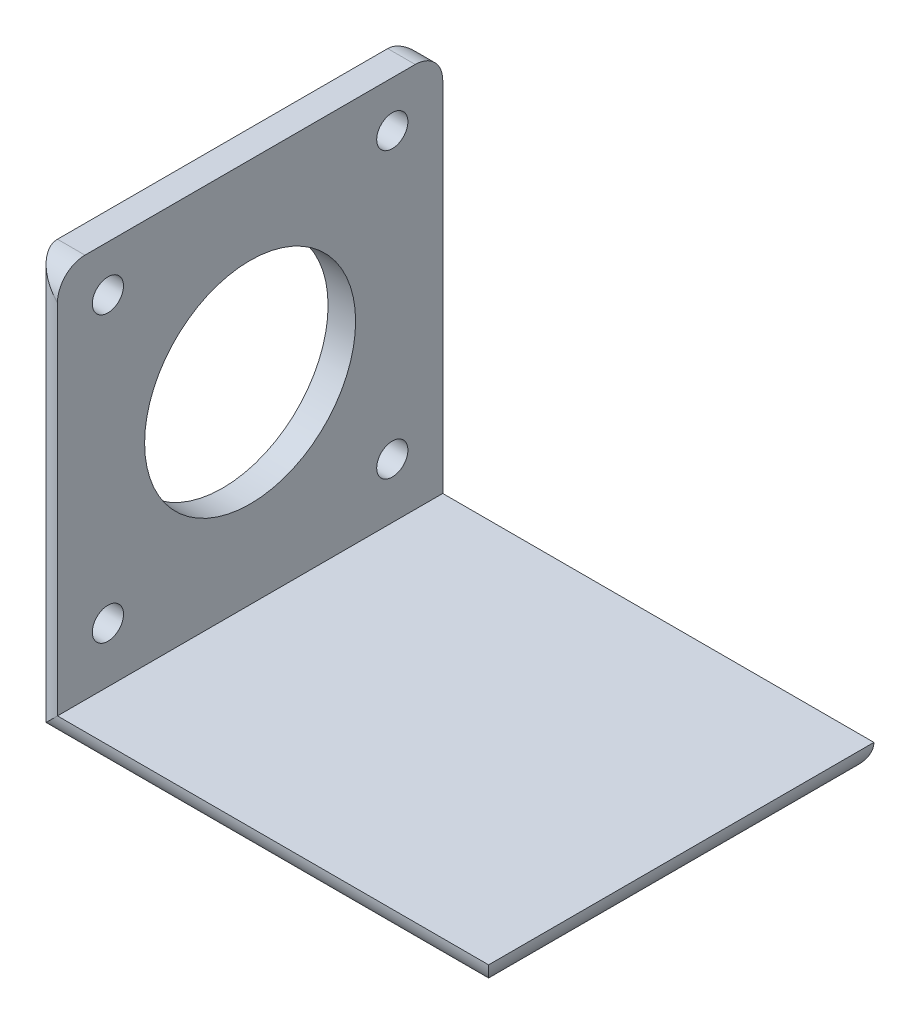
ISO-10303-21;
HEADER;
FILE_DESCRIPTION(('STEP AP214'),'2;1');
FILE_NAME('part.step','',(''),(''),'','','');
FILE_SCHEMA(('AUTOMOTIVE_DESIGN { 1 0 10303 214 1 1 1 1 }'));
ENDSEC;
DATA;
#1=APPLICATION_CONTEXT('core data for automotive mechanical design processes');
#2=APPLICATION_PROTOCOL_DEFINITION('international standard','automotive_design',2000,#1);
#3=PRODUCT_CONTEXT('',#1,'mechanical');
#4=PRODUCT('Part','Part','',(#3));
#5=PRODUCT_RELATED_PRODUCT_CATEGORY('part','',(#4));
#6=PRODUCT_DEFINITION_FORMATION('','',#4);
#7=PRODUCT_DEFINITION_CONTEXT('part definition',#1,'design');
#8=PRODUCT_DEFINITION('design','',#6,#7);
#9=PRODUCT_DEFINITION_SHAPE('','',#8);
#10=(LENGTH_UNIT() NAMED_UNIT(*) SI_UNIT(.MILLI.,.METRE.));
#11=(NAMED_UNIT(*) PLANE_ANGLE_UNIT() SI_UNIT($,.RADIAN.));
#12=(NAMED_UNIT(*) SI_UNIT($,.STERADIAN.) SOLID_ANGLE_UNIT());
#13=UNCERTAINTY_MEASURE_WITH_UNIT(LENGTH_MEASURE(1.E-05),#10,'distance_accuracy_value','');
#14=(GEOMETRIC_REPRESENTATION_CONTEXT(3) GLOBAL_UNCERTAINTY_ASSIGNED_CONTEXT((#13)) GLOBAL_UNIT_ASSIGNED_CONTEXT((#10,
#11,#12)) REPRESENTATION_CONTEXT('',''));
#15=CARTESIAN_POINT('',(0.,0.,0.));
#16=DIRECTION('',(0.,0.,1.));
#17=DIRECTION('',(1.,0.,0.));
#18=AXIS2_PLACEMENT_3D('',#15,#16,#17);
#19=CARTESIAN_POINT('',(0.,0.,21.));
#20=DIRECTION('',(0.,1.,0.));
#21=DIRECTION('',(0.,0.,1.));
#22=AXIS2_PLACEMENT_3D('',#19,#20,#21);
#23=PLANE('',#22);
#24=DIRECTION('',(0.,0.,-1.));
#25=VECTOR('',#24,1.);
#26=CARTESIAN_POINT('',(0.,0.,21.));
#27=LINE('',#26,#25);
#28=CARTESIAN_POINT('',(0.,0.,18.));
#29=VERTEX_POINT('',#28);
#30=CARTESIAN_POINT('',(0.,0.,-18.));
#31=VERTEX_POINT('',#30);
#32=EDGE_CURVE('E161',#29,#31,#27,.T.);
#33=ORIENTED_EDGE('',*,*,#32,.T.);
#34=DIRECTION('',(1.,0.,0.));
#35=VECTOR('',#34,1.);
#36=CARTESIAN_POINT('',(50.,0.,-18.));
#37=LINE('',#36,#35);
#38=CARTESIAN_POINT('',(47.,0.,-18.));
#39=VERTEX_POINT('',#38);
#40=EDGE_CURVE('E140',#31,#39,#37,.T.);
#41=ORIENTED_EDGE('',*,*,#40,.T.);
#42=DIRECTION('',(0.,0.,-1.));
#43=VECTOR('',#42,1.);
#44=CARTESIAN_POINT('',(47.,0.,21.));
#45=LINE('',#44,#43);
#46=CARTESIAN_POINT('',(47.,0.,18.));
#47=VERTEX_POINT('',#46);
#48=EDGE_CURVE('E137',#39,#47,#45,.F.);
#49=ORIENTED_EDGE('',*,*,#48,.T.);
#50=DIRECTION('',(1.,0.,0.));
#51=VECTOR('',#50,1.);
#52=CARTESIAN_POINT('',(0.,0.,18.));
#53=LINE('',#52,#51);
#54=EDGE_CURVE('E118',#47,#29,#53,.F.);
#55=ORIENTED_EDGE('',*,*,#54,.T.);
#56=EDGE_LOOP('',(#33,#41,#49,#55));
#57=FACE_BOUND('',#56,.T.);
#58=ADVANCED_FACE('F39',(#57),#23,.F.);
#59=CARTESIAN_POINT('',(3.00000000000001,3.,21.));
#60=DIRECTION('',(0.,-1.,0.));
#61=DIRECTION('',(0.,0.,-1.));
#62=AXIS2_PLACEMENT_3D('',#59,#60,#61);
#63=PLANE('',#62);
#64=DIRECTION('',(-1.,0.,0.));
#65=VECTOR('',#64,1.);
#66=CARTESIAN_POINT('',(3.00000000000001,3.,-21.));
#67=LINE('',#66,#65);
#68=CARTESIAN_POINT('',(50.,3.,-21.));
#69=VERTEX_POINT('',#68);
#70=CARTESIAN_POINT('',(3.00000000000001,3.,-21.));
#71=VERTEX_POINT('',#70);
#72=EDGE_CURVE('E155',#69,#71,#67,.T.);
#73=ORIENTED_EDGE('',*,*,#72,.T.);
#74=DIRECTION('',(0.,0.,-1.));
#75=VECTOR('',#74,1.);
#76=CARTESIAN_POINT('',(3.00000000000001,3.,21.));
#77=LINE('',#76,#75);
#78=CARTESIAN_POINT('',(3.00000000000001,3.,21.));
#79=VERTEX_POINT('',#78);
#80=EDGE_CURVE('E104',#79,#71,#77,.T.);
#81=ORIENTED_EDGE('',*,*,#80,.F.);
#82=DIRECTION('',(-1.,0.,0.));
#83=VECTOR('',#82,1.);
#84=CARTESIAN_POINT('',(3.00000000000001,3.,21.));
#85=LINE('',#84,#83);
#86=CARTESIAN_POINT('',(50.,3.,21.));
#87=VERTEX_POINT('',#86);
#88=EDGE_CURVE('E98',#87,#79,#85,.T.);
#89=ORIENTED_EDGE('',*,*,#88,.F.);
#90=DIRECTION('',(0.,0.,-1.));
#91=VECTOR('',#90,1.);
#92=CARTESIAN_POINT('',(50.,3.,21.));
#93=LINE('',#92,#91);
#94=EDGE_CURVE('E105',#87,#69,#93,.T.);
#95=ORIENTED_EDGE('',*,*,#94,.T.);
#96=EDGE_LOOP('',(#73,#81,#89,#95));
#97=FACE_BOUND('',#96,.T.);
#98=ADVANCED_FACE('F99',(#97),#63,.F.);
#99=CARTESIAN_POINT('',(3.,45.,21.));
#100=DIRECTION('',(-1.,0.,0.));
#101=DIRECTION('',(0.,-1.,0.));
#102=AXIS2_PLACEMENT_3D('',#99,#100,#101);
#103=PLANE('',#102);
#104=CARTESIAN_POINT('',(3.,40.,-15.5));
#105=DIRECTION('',(1.,0.,0.));
#106=DIRECTION('',(0.,-1.,0.));
#107=AXIS2_PLACEMENT_3D('',#104,#105,#106);
#108=CIRCLE('',#107,1.7);
#109=CARTESIAN_POINT('',(3.,38.3,-15.5));
#110=VERTEX_POINT('',#109);
#111=EDGE_CURVE('E254',#110,#110,#108,.T.);
#112=ORIENTED_EDGE('',*,*,#111,.F.);
#113=EDGE_LOOP('',(#112));
#114=FACE_BOUND('',#113,.T.);
#115=CARTESIAN_POINT('',(3.,9.00000000000001,-15.5));
#116=DIRECTION('',(1.,0.,0.));
#117=DIRECTION('',(0.,1.,0.));
#118=AXIS2_PLACEMENT_3D('',#115,#116,#117);
#119=CIRCLE('',#118,1.7);
#120=CARTESIAN_POINT('',(3.,10.7,-15.5));
#121=VERTEX_POINT('',#120);
#122=EDGE_CURVE('E246',#121,#121,#119,.T.);
#123=ORIENTED_EDGE('',*,*,#122,.F.);
#124=EDGE_LOOP('',(#123));
#125=FACE_BOUND('',#124,.T.);
#126=CARTESIAN_POINT('',(3.,40.,15.5));
#127=DIRECTION('',(1.,0.,0.));
#128=DIRECTION('',(0.,1.,0.));
#129=AXIS2_PLACEMENT_3D('',#126,#127,#128);
#130=CIRCLE('',#129,1.7);
#131=CARTESIAN_POINT('',(3.,41.7,15.5));
#132=VERTEX_POINT('',#131);
#133=EDGE_CURVE('E243',#132,#132,#130,.T.);
#134=ORIENTED_EDGE('',*,*,#133,.F.);
#135=EDGE_LOOP('',(#134));
#136=FACE_BOUND('',#135,.T.);
#137=CARTESIAN_POINT('',(3.,9.,15.5));
#138=DIRECTION('',(1.,0.,0.));
#139=DIRECTION('',(0.,-1.,0.));
#140=AXIS2_PLACEMENT_3D('',#137,#138,#139);
#141=CIRCLE('',#140,1.7);
#142=CARTESIAN_POINT('',(3.,7.3,15.5));
#143=VERTEX_POINT('',#142);
#144=EDGE_CURVE('E233',#143,#143,#141,.T.);
#145=ORIENTED_EDGE('',*,*,#144,.F.);
#146=EDGE_LOOP('',(#145));
#147=FACE_BOUND('',#146,.T.);
#148=CARTESIAN_POINT('',(3.,24.,0.));
#149=DIRECTION('',(1.,0.,0.));
#150=DIRECTION('',(0.,1.,0.));
#151=AXIS2_PLACEMENT_3D('',#148,#149,#150);
#152=CIRCLE('',#151,11.5);
#153=CARTESIAN_POINT('',(3.,35.5,0.));
#154=VERTEX_POINT('',#153);
#155=EDGE_CURVE('E240',#154,#154,#152,.T.);
#156=ORIENTED_EDGE('',*,*,#155,.F.);
#157=EDGE_LOOP('',(#156));
#158=FACE_BOUND('',#157,.T.);
#159=DIRECTION('',(0.,1.,0.));
#160=VECTOR('',#159,1.);
#161=CARTESIAN_POINT('',(3.,45.,-21.));
#162=LINE('',#161,#160);
#163=CARTESIAN_POINT('',(3.,42.,-21.));
#164=VERTEX_POINT('',#163);
#165=EDGE_CURVE('E109',#71,#164,#162,.T.);
#166=ORIENTED_EDGE('',*,*,#165,.T.);
#167=CARTESIAN_POINT('',(3.,42.,-18.));
#168=DIRECTION('',(-1.,0.,0.));
#169=DIRECTION('',(0.,-1.,0.));
#170=AXIS2_PLACEMENT_3D('',#167,#168,#169);
#171=CIRCLE('',#170,3.);
#172=CARTESIAN_POINT('',(3.,45.,-18.));
#173=VERTEX_POINT('',#172);
#174=EDGE_CURVE('E11',#164,#173,#171,.F.);
#175=ORIENTED_EDGE('',*,*,#174,.T.);
#176=DIRECTION('',(0.,0.,-1.));
#177=VECTOR('',#176,1.);
#178=CARTESIAN_POINT('',(3.,45.,21.));
#179=LINE('',#178,#177);
#180=CARTESIAN_POINT('',(3.,45.,18.));
#181=VERTEX_POINT('',#180);
#182=EDGE_CURVE('E129',#181,#173,#179,.T.);
#183=ORIENTED_EDGE('',*,*,#182,.F.);
#184=CARTESIAN_POINT('',(3.,42.,18.));
#185=DIRECTION('',(-1.,0.,0.));
#186=DIRECTION('',(0.,-1.,0.));
#187=AXIS2_PLACEMENT_3D('',#184,#185,#186);
#188=CIRCLE('',#187,3.);
#189=CARTESIAN_POINT('',(3.,42.,21.));
#190=VERTEX_POINT('',#189);
#191=EDGE_CURVE('E48',#181,#190,#188,.F.);
#192=ORIENTED_EDGE('',*,*,#191,.T.);
#193=DIRECTION('',(0.,1.,0.));
#194=VECTOR('',#193,1.);
#195=CARTESIAN_POINT('',(3.,45.,21.));
#196=LINE('',#195,#194);
#197=EDGE_CURVE('E108',#79,#190,#196,.T.);
#198=ORIENTED_EDGE('',*,*,#197,.F.);
#199=ORIENTED_EDGE('',*,*,#80,.T.);
#200=EDGE_LOOP('',(#166,#175,#183,#192,#198,#199));
#201=FACE_BOUND('',#200,.T.);
#202=ADVANCED_FACE('F196',(#114,#125,#136,#147,#158,#201),#103,.F.);
#203=CARTESIAN_POINT('',(0.,45.,21.));
#204=DIRECTION('',(0.,-1.,0.));
#205=DIRECTION('',(0.,0.,-1.));
#206=AXIS2_PLACEMENT_3D('',#203,#204,#205);
#207=PLANE('',#206);
#208=ORIENTED_EDGE('',*,*,#182,.T.);
#209=DIRECTION('',(-1.,0.,0.));
#210=VECTOR('',#209,1.);
#211=CARTESIAN_POINT('',(0.,45.,-18.));
#212=LINE('',#211,#210);
#213=CARTESIAN_POINT('',(0.,45.,-18.));
#214=VERTEX_POINT('',#213);
#215=EDGE_CURVE('E143',#173,#214,#212,.T.);
#216=ORIENTED_EDGE('',*,*,#215,.T.);
#217=DIRECTION('',(0.,0.,-1.));
#218=VECTOR('',#217,1.);
#219=CARTESIAN_POINT('',(0.,45.,21.));
#220=LINE('',#219,#218);
#221=CARTESIAN_POINT('',(0.,45.,18.));
#222=VERTEX_POINT('',#221);
#223=EDGE_CURVE('E163',#222,#214,#220,.T.);
#224=ORIENTED_EDGE('',*,*,#223,.F.);
#225=DIRECTION('',(-1.,0.,0.));
#226=VECTOR('',#225,1.);
#227=CARTESIAN_POINT('',(0.,45.,18.));
#228=LINE('',#227,#226);
#229=EDGE_CURVE('E63',#222,#181,#228,.F.);
#230=ORIENTED_EDGE('',*,*,#229,.T.);
#231=EDGE_LOOP('',(#208,#216,#224,#230));
#232=FACE_BOUND('',#231,.T.);
#233=ADVANCED_FACE('F170',(#232),#207,.F.);
#234=CARTESIAN_POINT('',(0.,0.,21.));
#235=DIRECTION('',(1.,0.,0.));
#236=DIRECTION('',(0.,0.,-1.));
#237=AXIS2_PLACEMENT_3D('',#234,#235,#236);
#238=PLANE('',#237);
#239=CARTESIAN_POINT('',(0.,40.,-15.5));
#240=DIRECTION('',(1.,0.,0.));
#241=DIRECTION('',(0.,-1.,0.));
#242=AXIS2_PLACEMENT_3D('',#239,#240,#241);
#243=CIRCLE('',#242,1.7);
#244=CARTESIAN_POINT('',(0.,38.3,-15.5));
#245=VERTEX_POINT('',#244);
#246=EDGE_CURVE('E256',#245,#245,#243,.T.);
#247=ORIENTED_EDGE('',*,*,#246,.T.);
#248=EDGE_LOOP('',(#247));
#249=FACE_BOUND('',#248,.T.);
#250=CARTESIAN_POINT('',(0.,9.00000000000001,-15.5));
#251=DIRECTION('',(1.,0.,0.));
#252=DIRECTION('',(0.,1.,0.));
#253=AXIS2_PLACEMENT_3D('',#250,#251,#252);
#254=CIRCLE('',#253,1.7);
#255=CARTESIAN_POINT('',(0.,10.7,-15.5));
#256=VERTEX_POINT('',#255);
#257=EDGE_CURVE('E252',#256,#256,#254,.T.);
#258=ORIENTED_EDGE('',*,*,#257,.T.);
#259=EDGE_LOOP('',(#258));
#260=FACE_BOUND('',#259,.T.);
#261=CARTESIAN_POINT('',(0.,40.,15.5));
#262=DIRECTION('',(1.,0.,0.));
#263=DIRECTION('',(0.,1.,0.));
#264=AXIS2_PLACEMENT_3D('',#261,#262,#263);
#265=CIRCLE('',#264,1.7);
#266=CARTESIAN_POINT('',(0.,41.7,15.5));
#267=VERTEX_POINT('',#266);
#268=EDGE_CURVE('E247',#267,#267,#265,.T.);
#269=ORIENTED_EDGE('',*,*,#268,.T.);
#270=EDGE_LOOP('',(#269));
#271=FACE_BOUND('',#270,.T.);
#272=CARTESIAN_POINT('',(0.,9.,15.5));
#273=DIRECTION('',(1.,0.,0.));
#274=DIRECTION('',(0.,-1.,0.));
#275=AXIS2_PLACEMENT_3D('',#272,#273,#274);
#276=CIRCLE('',#275,1.7);
#277=CARTESIAN_POINT('',(0.,7.3,15.5));
#278=VERTEX_POINT('',#277);
#279=EDGE_CURVE('E234',#278,#278,#276,.T.);
#280=ORIENTED_EDGE('',*,*,#279,.T.);
#281=EDGE_LOOP('',(#280));
#282=FACE_BOUND('',#281,.T.);
#283=CARTESIAN_POINT('',(0.,24.,0.));
#284=DIRECTION('',(1.,0.,0.));
#285=DIRECTION('',(0.,1.,0.));
#286=AXIS2_PLACEMENT_3D('',#283,#284,#285);
#287=CIRCLE('',#286,11.5);
#288=CARTESIAN_POINT('',(0.,35.5,0.));
#289=VERTEX_POINT('',#288);
#290=EDGE_CURVE('E150',#289,#289,#287,.T.);
#291=ORIENTED_EDGE('',*,*,#290,.T.);
#292=EDGE_LOOP('',(#291));
#293=FACE_BOUND('',#292,.T.);
#294=ORIENTED_EDGE('',*,*,#223,.T.);
#295=DIRECTION('',(0.,-1.,0.));
#296=VECTOR('',#295,1.);
#297=CARTESIAN_POINT('',(0.,0.,-18.));
#298=LINE('',#297,#296);
#299=EDGE_CURVE('E130',#214,#31,#298,.T.);
#300=ORIENTED_EDGE('',*,*,#299,.T.);
#301=ORIENTED_EDGE('',*,*,#32,.F.);
#302=DIRECTION('',(0.,-1.,0.));
#303=VECTOR('',#302,1.);
#304=CARTESIAN_POINT('',(0.,0.,18.));
#305=LINE('',#304,#303);
#306=EDGE_CURVE('E123',#29,#222,#305,.F.);
#307=ORIENTED_EDGE('',*,*,#306,.T.);
#308=EDGE_LOOP('',(#294,#300,#301,#307));
#309=FACE_BOUND('',#308,.T.);
#310=ADVANCED_FACE('F178',(#249,#260,#271,#282,#293,#309),#238,.F.);
#311=CARTESIAN_POINT('',(0.,42.,18.));
#312=DIRECTION('',(-1.,0.,0.));
#313=DIRECTION('',(0.,0.,1.));
#314=AXIS2_PLACEMENT_3D('',#311,#312,#313);
#315=CYLINDRICAL_SURFACE('',#314,3.);
#316=ORIENTED_EDGE('',*,*,#191,.F.);
#317=ORIENTED_EDGE('',*,*,#229,.F.);
#318=CARTESIAN_POINT('',(3.,42.,18.));
#319=DIRECTION('',(-0.707106781186547,-0.707106781186547,0.));
#320=DIRECTION('',(-0.707106781186547,0.707106781186547,0.));
#321=AXIS2_PLACEMENT_3D('',#318,#319,#320);
#322=ELLIPSE('',#321,4.24264068711928,3.);
#323=EDGE_CURVE('E43',#190,#222,#322,.T.);
#324=ORIENTED_EDGE('',*,*,#323,.F.);
#325=EDGE_LOOP('',(#316,#317,#324));
#326=FACE_BOUND('',#325,.T.);
#327=ADVANCED_FACE('F41',(#326),#315,.T.);
#328=CARTESIAN_POINT('',(3.,0.,18.));
#329=DIRECTION('',(0.,-1.,0.));
#330=DIRECTION('',(0.,0.,-1.));
#331=AXIS2_PLACEMENT_3D('',#328,#329,#330);
#332=CYLINDRICAL_SURFACE('',#331,3.);
#333=ORIENTED_EDGE('',*,*,#323,.T.);
#334=ORIENTED_EDGE('',*,*,#306,.F.);
#335=CARTESIAN_POINT('',(3.,3.,18.));
#336=DIRECTION('',(0.707106781186547,-0.707106781186547,0.));
#337=DIRECTION('',(0.707106781186547,0.707106781186547,0.));
#338=AXIS2_PLACEMENT_3D('',#335,#336,#337);
#339=ELLIPSE('',#338,4.24264068711928,3.);
#340=EDGE_CURVE('E119',#79,#29,#339,.T.);
#341=ORIENTED_EDGE('',*,*,#340,.F.);
#342=ORIENTED_EDGE('',*,*,#197,.T.);
#343=EDGE_LOOP('',(#333,#334,#341,#342));
#344=FACE_BOUND('',#343,.T.);
#345=ADVANCED_FACE('F270',(#344),#332,.T.);
#346=CARTESIAN_POINT('',(0.,3.,18.));
#347=DIRECTION('',(1.,0.,0.));
#348=DIRECTION('',(0.,0.,-1.));
#349=AXIS2_PLACEMENT_3D('',#346,#347,#348);
#350=CYLINDRICAL_SURFACE('',#349,3.);
#351=ORIENTED_EDGE('',*,*,#340,.T.);
#352=ORIENTED_EDGE('',*,*,#54,.F.);
#353=CARTESIAN_POINT('',(47.,3.,18.));
#354=DIRECTION('',(0.707106781186547,0.,-0.707106781186547));
#355=DIRECTION('',(0.707106781186547,0.,0.707106781186547));
#356=AXIS2_PLACEMENT_3D('',#353,#354,#355);
#357=ELLIPSE('',#356,4.24264068711928,3.);
#358=EDGE_CURVE('E111',#87,#47,#357,.T.);
#359=ORIENTED_EDGE('',*,*,#358,.F.);
#360=ORIENTED_EDGE('',*,*,#88,.T.);
#361=EDGE_LOOP('',(#351,#352,#359,#360));
#362=FACE_BOUND('',#361,.T.);
#363=ADVANCED_FACE('F113',(#362),#350,.T.);
#364=CARTESIAN_POINT('',(47.,3.,21.));
#365=DIRECTION('',(0.,0.,-1.));
#366=DIRECTION('',(-1.,0.,0.));
#367=AXIS2_PLACEMENT_3D('',#364,#365,#366);
#368=CYLINDRICAL_SURFACE('',#367,3.);
#369=ORIENTED_EDGE('',*,*,#358,.T.);
#370=ORIENTED_EDGE('',*,*,#48,.F.);
#371=CARTESIAN_POINT('',(47.,3.,-18.));
#372=DIRECTION('',(-0.707106781186547,0.,-0.707106781186547));
#373=DIRECTION('',(0.707106781186547,0.,-0.707106781186547));
#374=AXIS2_PLACEMENT_3D('',#371,#372,#373);
#375=ELLIPSE('',#374,4.24264068711928,3.);
#376=EDGE_CURVE('E117',#69,#39,#375,.T.);
#377=ORIENTED_EDGE('',*,*,#376,.F.);
#378=ORIENTED_EDGE('',*,*,#94,.F.);
#379=EDGE_LOOP('',(#369,#370,#377,#378));
#380=FACE_BOUND('',#379,.T.);
#381=ADVANCED_FACE('F124',(#380),#368,.T.);
#382=CARTESIAN_POINT('',(0.,42.,-18.));
#383=DIRECTION('',(1.,0.,0.));
#384=DIRECTION('',(0.,0.,-1.));
#385=AXIS2_PLACEMENT_3D('',#382,#383,#384);
#386=CYLINDRICAL_SURFACE('',#385,3.);
#387=ORIENTED_EDGE('',*,*,#215,.F.);
#388=ORIENTED_EDGE('',*,*,#174,.F.);
#389=CARTESIAN_POINT('',(3.,42.,-18.));
#390=DIRECTION('',(0.707106781186547,0.707106781186547,0.));
#391=DIRECTION('',(0.707106781186547,-0.707106781186547,0.));
#392=AXIS2_PLACEMENT_3D('',#389,#390,#391);
#393=ELLIPSE('',#392,4.24264068711928,3.);
#394=EDGE_CURVE('E148',#214,#164,#393,.F.);
#395=ORIENTED_EDGE('',*,*,#394,.F.);
#396=EDGE_LOOP('',(#387,#388,#395));
#397=FACE_BOUND('',#396,.T.);
#398=ADVANCED_FACE('F173',(#397),#386,.T.);
#399=CARTESIAN_POINT('',(0.,3.,-18.));
#400=DIRECTION('',(-1.,0.,0.));
#401=DIRECTION('',(0.,0.,1.));
#402=AXIS2_PLACEMENT_3D('',#399,#400,#401);
#403=CYLINDRICAL_SURFACE('',#402,3.);
#404=ORIENTED_EDGE('',*,*,#376,.T.);
#405=ORIENTED_EDGE('',*,*,#40,.F.);
#406=CARTESIAN_POINT('',(3.,3.,-18.));
#407=DIRECTION('',(-0.707106781186547,0.707106781186547,0.));
#408=DIRECTION('',(-0.707106781186547,-0.707106781186547,0.));
#409=AXIS2_PLACEMENT_3D('',#406,#407,#408);
#410=ELLIPSE('',#409,4.24264068711928,3.);
#411=EDGE_CURVE('E145',#71,#31,#410,.T.);
#412=ORIENTED_EDGE('',*,*,#411,.F.);
#413=ORIENTED_EDGE('',*,*,#72,.F.);
#414=EDGE_LOOP('',(#404,#405,#412,#413));
#415=FACE_BOUND('',#414,.T.);
#416=ADVANCED_FACE('F181',(#415),#403,.T.);
#417=CARTESIAN_POINT('',(3.,0.,-18.));
#418=DIRECTION('',(0.,1.,0.));
#419=DIRECTION('',(0.,0.,1.));
#420=AXIS2_PLACEMENT_3D('',#417,#418,#419);
#421=CYLINDRICAL_SURFACE('',#420,3.);
#422=ORIENTED_EDGE('',*,*,#394,.T.);
#423=ORIENTED_EDGE('',*,*,#165,.F.);
#424=ORIENTED_EDGE('',*,*,#411,.T.);
#425=ORIENTED_EDGE('',*,*,#299,.F.);
#426=EDGE_LOOP('',(#422,#423,#424,#425));
#427=FACE_BOUND('',#426,.T.);
#428=ADVANCED_FACE('F172',(#427),#421,.T.);
#429=CARTESIAN_POINT('',(0.,24.,0.));
#430=DIRECTION('',(1.,0.,0.));
#431=DIRECTION('',(0.,1.,0.));
#432=AXIS2_PLACEMENT_3D('',#429,#430,#431);
#433=CYLINDRICAL_SURFACE('',#432,11.5);
#434=ORIENTED_EDGE('',*,*,#290,.F.);
#435=EDGE_LOOP('',(#434));
#436=FACE_BOUND('',#435,.T.);
#437=ORIENTED_EDGE('',*,*,#155,.T.);
#438=EDGE_LOOP('',(#437));
#439=FACE_BOUND('',#438,.T.);
#440=ADVANCED_FACE('F187',(#436,#439),#433,.F.);
#441=CARTESIAN_POINT('',(0.,9.,15.5));
#442=DIRECTION('',(1.,0.,0.));
#443=DIRECTION('',(0.,1.,0.));
#444=AXIS2_PLACEMENT_3D('',#441,#442,#443);
#445=CYLINDRICAL_SURFACE('',#444,1.7);
#446=ORIENTED_EDGE('',*,*,#279,.F.);
#447=EDGE_LOOP('',(#446));
#448=FACE_BOUND('',#447,.T.);
#449=ORIENTED_EDGE('',*,*,#144,.T.);
#450=EDGE_LOOP('',(#449));
#451=FACE_BOUND('',#450,.T.);
#452=ADVANCED_FACE('F211',(#448,#451),#445,.F.);
#453=CARTESIAN_POINT('',(0.,40.,15.5));
#454=DIRECTION('',(1.,0.,0.));
#455=DIRECTION('',(0.,1.,0.));
#456=AXIS2_PLACEMENT_3D('',#453,#454,#455);
#457=CYLINDRICAL_SURFACE('',#456,1.7);
#458=ORIENTED_EDGE('',*,*,#268,.F.);
#459=EDGE_LOOP('',(#458));
#460=FACE_BOUND('',#459,.T.);
#461=ORIENTED_EDGE('',*,*,#133,.T.);
#462=EDGE_LOOP('',(#461));
#463=FACE_BOUND('',#462,.T.);
#464=ADVANCED_FACE('F219',(#460,#463),#457,.F.);
#465=CARTESIAN_POINT('',(0.,9.00000000000001,-15.5));
#466=DIRECTION('',(1.,0.,0.));
#467=DIRECTION('',(0.,1.,0.));
#468=AXIS2_PLACEMENT_3D('',#465,#466,#467);
#469=CYLINDRICAL_SURFACE('',#468,1.7);
#470=ORIENTED_EDGE('',*,*,#257,.F.);
#471=EDGE_LOOP('',(#470));
#472=FACE_BOUND('',#471,.T.);
#473=ORIENTED_EDGE('',*,*,#122,.T.);
#474=EDGE_LOOP('',(#473));
#475=FACE_BOUND('',#474,.T.);
#476=ADVANCED_FACE('F216',(#472,#475),#469,.F.);
#477=CARTESIAN_POINT('',(0.,40.,-15.5));
#478=DIRECTION('',(1.,0.,0.));
#479=DIRECTION('',(0.,1.,0.));
#480=AXIS2_PLACEMENT_3D('',#477,#478,#479);
#481=CYLINDRICAL_SURFACE('',#480,1.7);
#482=ORIENTED_EDGE('',*,*,#246,.F.);
#483=EDGE_LOOP('',(#482));
#484=FACE_BOUND('',#483,.T.);
#485=ORIENTED_EDGE('',*,*,#111,.T.);
#486=EDGE_LOOP('',(#485));
#487=FACE_BOUND('',#486,.T.);
#488=ADVANCED_FACE('F213',(#484,#487),#481,.F.);
#489=CLOSED_SHELL('',(#58,#98,#202,#233,#310,#327,#345,#363,#381,#398,#416,#428,#440,#452,#464,
#476,#488));
#490=MANIFOLD_SOLID_BREP('B2',#489);
#491=ADVANCED_BREP_SHAPE_REPRESENTATION('',(#18,#490),#14);
#492=SHAPE_DEFINITION_REPRESENTATION(#9,#491);
ENDSEC;
END-ISO-10303-21;
